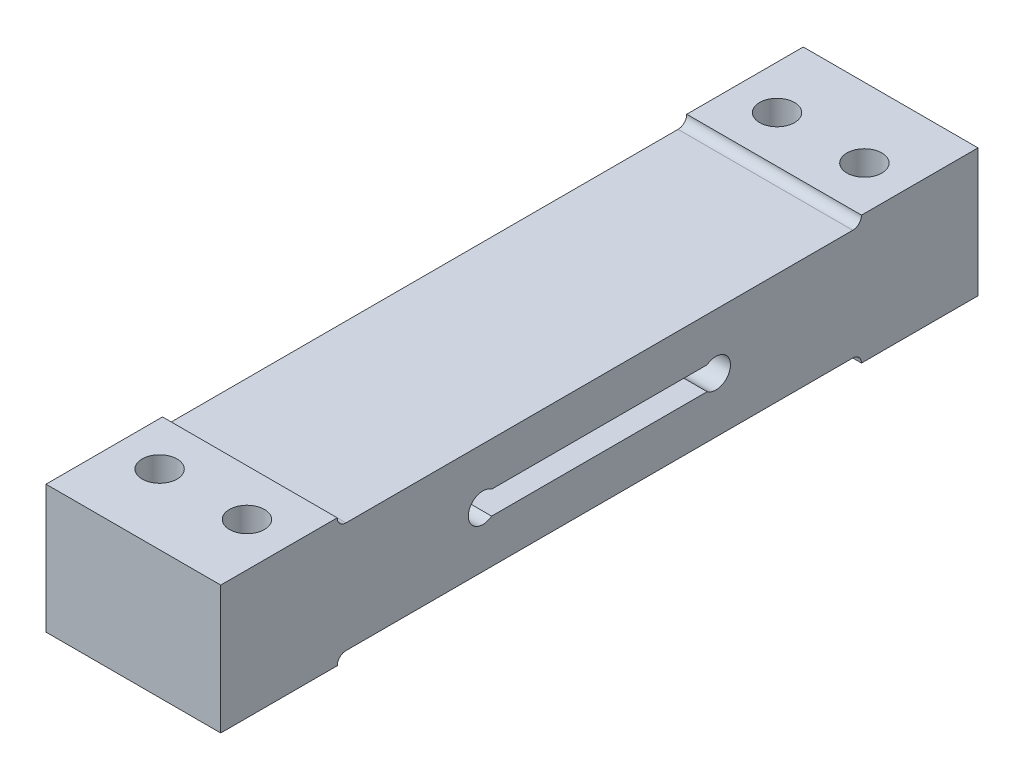
ISO-10303-21;
HEADER;
FILE_DESCRIPTION(('STEP AP214'),'2;1');
FILE_NAME('part.step','',(''),(''),'','','');
FILE_SCHEMA(('AUTOMOTIVE_DESIGN { 1 0 10303 214 1 1 1 1 }'));
ENDSEC;
DATA;
#1=APPLICATION_CONTEXT('core data for automotive mechanical design processes');
#2=APPLICATION_PROTOCOL_DEFINITION('international standard','automotive_design',2000,#1);
#3=PRODUCT_CONTEXT('',#1,'mechanical');
#4=PRODUCT('Part','Part','',(#3));
#5=PRODUCT_RELATED_PRODUCT_CATEGORY('part','',(#4));
#6=PRODUCT_DEFINITION_FORMATION('','',#4);
#7=PRODUCT_DEFINITION_CONTEXT('part definition',#1,'design');
#8=PRODUCT_DEFINITION('design','',#6,#7);
#9=PRODUCT_DEFINITION_SHAPE('','',#8);
#10=(LENGTH_UNIT() NAMED_UNIT(*) SI_UNIT(.MILLI.,.METRE.));
#11=(NAMED_UNIT(*) PLANE_ANGLE_UNIT() SI_UNIT($,.RADIAN.));
#12=(NAMED_UNIT(*) SI_UNIT($,.STERADIAN.) SOLID_ANGLE_UNIT());
#13=UNCERTAINTY_MEASURE_WITH_UNIT(LENGTH_MEASURE(1.E-05),#10,'distance_accuracy_value','');
#14=(GEOMETRIC_REPRESENTATION_CONTEXT(3) GLOBAL_UNCERTAINTY_ASSIGNED_CONTEXT((#13)) GLOBAL_UNIT_ASSIGNED_CONTEXT((#10,
#11,#12)) REPRESENTATION_CONTEXT('',''));
#15=CARTESIAN_POINT('',(0.,0.,0.));
#16=DIRECTION('',(0.,0.,1.));
#17=DIRECTION('',(1.,0.,0.));
#18=AXIS2_PLACEMENT_3D('',#15,#16,#17);
#19=CARTESIAN_POINT('',(15.,-11.,-65.));
#20=DIRECTION('',(0.,1.,0.));
#21=DIRECTION('',(0.,0.,1.));
#22=AXIS2_PLACEMENT_3D('',#19,#20,#21);
#23=PLANE('',#22);
#24=CARTESIAN_POINT('',(-7.5,-11.,-53.));
#25=DIRECTION('',(0.,1.,0.));
#26=DIRECTION('',(0.,0.,1.));
#27=AXIS2_PLACEMENT_3D('',#24,#25,#26);
#28=CIRCLE('',#27,3.);
#29=CARTESIAN_POINT('',(-7.5,-11.,-50.));
#30=VERTEX_POINT('',#29);
#31=EDGE_CURVE('E208',#30,#30,#28,.T.);
#32=ORIENTED_EDGE('',*,*,#31,.T.);
#33=EDGE_LOOP('',(#32));
#34=FACE_BOUND('',#33,.T.);
#35=CARTESIAN_POINT('',(7.5,-11.,-53.));
#36=DIRECTION('',(0.,1.,0.));
#37=DIRECTION('',(0.,0.,1.));
#38=AXIS2_PLACEMENT_3D('',#35,#36,#37);
#39=CIRCLE('',#38,3.);
#40=CARTESIAN_POINT('',(7.5,-11.,-50.));
#41=VERTEX_POINT('',#40);
#42=EDGE_CURVE('E196',#41,#41,#39,.T.);
#43=ORIENTED_EDGE('',*,*,#42,.T.);
#44=EDGE_LOOP('',(#43));
#45=FACE_BOUND('',#44,.T.);
#46=DIRECTION('',(0.,0.,-1.));
#47=VECTOR('',#46,1.);
#48=CARTESIAN_POINT('',(15.,-11.,-65.));
#49=LINE('',#48,#47);
#50=CARTESIAN_POINT('',(15.,-11.,-45.));
#51=VERTEX_POINT('',#50);
#52=CARTESIAN_POINT('',(15.,-11.,-65.));
#53=VERTEX_POINT('',#52);
#54=EDGE_CURVE('E247',#51,#53,#49,.T.);
#55=ORIENTED_EDGE('',*,*,#54,.F.);
#56=DIRECTION('',(1.,0.,0.));
#57=VECTOR('',#56,1.);
#58=CARTESIAN_POINT('',(-15.,-11.,-45.));
#59=LINE('',#58,#57);
#60=CARTESIAN_POINT('',(-15.,-11.,-45.));
#61=VERTEX_POINT('',#60);
#62=EDGE_CURVE('E185',#61,#51,#59,.T.);
#63=ORIENTED_EDGE('',*,*,#62,.F.);
#64=DIRECTION('',(0.,0.,-1.));
#65=VECTOR('',#64,1.);
#66=CARTESIAN_POINT('',(-15.,-11.,-65.));
#67=LINE('',#66,#65);
#68=CARTESIAN_POINT('',(-15.,-11.,-65.));
#69=VERTEX_POINT('',#68);
#70=EDGE_CURVE('E259',#61,#69,#67,.T.);
#71=ORIENTED_EDGE('',*,*,#70,.T.);
#72=DIRECTION('',(-1.,0.,0.));
#73=VECTOR('',#72,1.);
#74=CARTESIAN_POINT('',(15.,-11.,-65.));
#75=LINE('',#74,#73);
#76=EDGE_CURVE('E268',#53,#69,#75,.T.);
#77=ORIENTED_EDGE('',*,*,#76,.F.);
#78=EDGE_LOOP('',(#55,#63,#71,#77));
#79=FACE_BOUND('',#78,.T.);
#80=ADVANCED_FACE('F33',(#34,#45,#79),#23,.F.);
#81=CARTESIAN_POINT('',(15.,11.,-65.));
#82=DIRECTION('',(0.,-1.,0.));
#83=DIRECTION('',(0.,0.,-1.));
#84=AXIS2_PLACEMENT_3D('',#81,#82,#83);
#85=PLANE('',#84);
#86=CARTESIAN_POINT('',(7.5,11.,53.));
#87=DIRECTION('',(0.,1.,0.));
#88=DIRECTION('',(0.,0.,1.));
#89=AXIS2_PLACEMENT_3D('',#86,#87,#88);
#90=CIRCLE('',#89,3.);
#91=CARTESIAN_POINT('',(7.5,11.,56.));
#92=VERTEX_POINT('',#91);
#93=EDGE_CURVE('E172',#92,#92,#90,.T.);
#94=ORIENTED_EDGE('',*,*,#93,.F.);
#95=EDGE_LOOP('',(#94));
#96=FACE_BOUND('',#95,.T.);
#97=CARTESIAN_POINT('',(-7.5,11.,53.));
#98=DIRECTION('',(0.,1.,0.));
#99=DIRECTION('',(0.,0.,1.));
#100=AXIS2_PLACEMENT_3D('',#97,#98,#99);
#101=CIRCLE('',#100,3.);
#102=CARTESIAN_POINT('',(-7.5,11.,56.));
#103=VERTEX_POINT('',#102);
#104=EDGE_CURVE('E193',#103,#103,#101,.T.);
#105=ORIENTED_EDGE('',*,*,#104,.F.);
#106=EDGE_LOOP('',(#105));
#107=FACE_BOUND('',#106,.T.);
#108=DIRECTION('',(0.,0.,1.));
#109=VECTOR('',#108,1.);
#110=CARTESIAN_POINT('',(15.,11.,-65.));
#111=LINE('',#110,#109);
#112=CARTESIAN_POINT('',(15.,11.,45.));
#113=VERTEX_POINT('',#112);
#114=CARTESIAN_POINT('',(15.,11.,65.));
#115=VERTEX_POINT('',#114);
#116=EDGE_CURVE('E253',#113,#115,#111,.T.);
#117=ORIENTED_EDGE('',*,*,#116,.F.);
#118=DIRECTION('',(1.,0.,0.));
#119=VECTOR('',#118,1.);
#120=CARTESIAN_POINT('',(-15.,11.,45.));
#121=LINE('',#120,#119);
#122=CARTESIAN_POINT('',(-15.,11.,45.));
#123=VERTEX_POINT('',#122);
#124=EDGE_CURVE('E169',#123,#113,#121,.T.);
#125=ORIENTED_EDGE('',*,*,#124,.F.);
#126=DIRECTION('',(0.,0.,1.));
#127=VECTOR('',#126,1.);
#128=CARTESIAN_POINT('',(-15.,11.,-65.));
#129=LINE('',#128,#127);
#130=CARTESIAN_POINT('',(-15.,11.,65.));
#131=VERTEX_POINT('',#130);
#132=EDGE_CURVE('E166',#123,#131,#129,.T.);
#133=ORIENTED_EDGE('',*,*,#132,.T.);
#134=DIRECTION('',(-1.,0.,0.));
#135=VECTOR('',#134,1.);
#136=CARTESIAN_POINT('',(15.,11.,65.));
#137=LINE('',#136,#135);
#138=EDGE_CURVE('E256',#115,#131,#137,.T.);
#139=ORIENTED_EDGE('',*,*,#138,.F.);
#140=EDGE_LOOP('',(#117,#125,#133,#139));
#141=FACE_BOUND('',#140,.T.);
#142=ADVANCED_FACE('F300',(#96,#107,#141),#85,.F.);
#143=CARTESIAN_POINT('',(15.,0.,0.));
#144=DIRECTION('',(1.,0.,0.));
#145=DIRECTION('',(0.,0.,-1.));
#146=AXIS2_PLACEMENT_3D('',#143,#144,#145);
#147=PLANE('',#146);
#148=DIRECTION('',(0.,0.,-1.));
#149=VECTOR('',#148,1.);
#150=CARTESIAN_POINT('',(15.,9.50000000000001,45.));
#151=LINE('',#150,#149);
#152=CARTESIAN_POINT('',(15.,9.50000000000001,43.5));
#153=VERTEX_POINT('',#152);
#154=CARTESIAN_POINT('',(15.,9.50000000000001,-43.5));
#155=VERTEX_POINT('',#154);
#156=EDGE_CURVE('E174',#153,#155,#151,.T.);
#157=ORIENTED_EDGE('',*,*,#156,.F.);
#158=CARTESIAN_POINT('',(15.,11.,43.5));
#159=DIRECTION('',(1.,0.,0.));
#160=DIRECTION('',(0.,0.,-1.));
#161=AXIS2_PLACEMENT_3D('',#158,#159,#160);
#162=CIRCLE('',#161,1.5);
#163=EDGE_CURVE('E41',#153,#113,#162,.F.);
#164=ORIENTED_EDGE('',*,*,#163,.T.);
#165=ORIENTED_EDGE('',*,*,#116,.T.);
#166=DIRECTION('',(0.,-1.,0.));
#167=VECTOR('',#166,1.);
#168=CARTESIAN_POINT('',(15.,-11.,65.));
#169=LINE('',#168,#167);
#170=CARTESIAN_POINT('',(15.,-11.,65.));
#171=VERTEX_POINT('',#170);
#172=EDGE_CURVE('E165',#115,#171,#169,.T.);
#173=ORIENTED_EDGE('',*,*,#172,.T.);
#174=CARTESIAN_POINT('',(15.,-11.,45.));
#175=VERTEX_POINT('',#174);
#176=EDGE_CURVE('E248',#171,#175,#49,.T.);
#177=ORIENTED_EDGE('',*,*,#176,.T.);
#178=CARTESIAN_POINT('',(15.,-11.,43.5));
#179=DIRECTION('',(1.,0.,0.));
#180=DIRECTION('',(0.,0.,-1.));
#181=AXIS2_PLACEMENT_3D('',#178,#179,#180);
#182=CIRCLE('',#181,1.5);
#183=CARTESIAN_POINT('',(15.,-9.50000000000001,43.5));
#184=VERTEX_POINT('',#183);
#185=EDGE_CURVE('E283',#175,#184,#182,.F.);
#186=ORIENTED_EDGE('',*,*,#185,.T.);
#187=DIRECTION('',(0.,0.,1.));
#188=VECTOR('',#187,1.);
#189=CARTESIAN_POINT('',(15.,-9.50000000000001,45.));
#190=LINE('',#189,#188);
#191=CARTESIAN_POINT('',(15.,-9.50000000000001,-43.5));
#192=VERTEX_POINT('',#191);
#193=EDGE_CURVE('E182',#192,#184,#190,.T.);
#194=ORIENTED_EDGE('',*,*,#193,.F.);
#195=CARTESIAN_POINT('',(15.,-11.,-43.5));
#196=DIRECTION('',(1.,0.,0.));
#197=DIRECTION('',(0.,0.,-1.));
#198=AXIS2_PLACEMENT_3D('',#195,#196,#197);
#199=CIRCLE('',#198,1.5);
#200=EDGE_CURVE('E287',#192,#51,#199,.F.);
#201=ORIENTED_EDGE('',*,*,#200,.T.);
#202=ORIENTED_EDGE('',*,*,#54,.T.);
#203=DIRECTION('',(0.,1.,0.));
#204=VECTOR('',#203,1.);
#205=CARTESIAN_POINT('',(15.,-11.,-65.));
#206=LINE('',#205,#204);
#207=CARTESIAN_POINT('',(15.,11.,-65.));
#208=VERTEX_POINT('',#207);
#209=EDGE_CURVE('E251',#53,#208,#206,.T.);
#210=ORIENTED_EDGE('',*,*,#209,.T.);
#211=CARTESIAN_POINT('',(15.,11.,-45.));
#212=VERTEX_POINT('',#211);
#213=EDGE_CURVE('E254',#208,#212,#111,.T.);
#214=ORIENTED_EDGE('',*,*,#213,.T.);
#215=CARTESIAN_POINT('',(15.,11.,-43.5));
#216=DIRECTION('',(1.,0.,0.));
#217=DIRECTION('',(0.,0.,-1.));
#218=AXIS2_PLACEMENT_3D('',#215,#216,#217);
#219=CIRCLE('',#218,1.5);
#220=EDGE_CURVE('E154',#212,#155,#219,.F.);
#221=ORIENTED_EDGE('',*,*,#220,.T.);
#222=EDGE_LOOP('',(#157,#164,#165,#173,#177,#186,#194,#201,#202,#210,#214,#221));
#223=FACE_BOUND('',#222,.T.);
#224=DIRECTION('',(0.,0.,-1.));
#225=VECTOR('',#224,1.);
#226=CARTESIAN_POINT('',(15.,-2.,18.5));
#227=LINE('',#226,#225);
#228=CARTESIAN_POINT('',(15.,-2.,18.5));
#229=VERTEX_POINT('',#228);
#230=CARTESIAN_POINT('',(15.,-2.,-18.5));
#231=VERTEX_POINT('',#230);
#232=EDGE_CURVE('E216',#229,#231,#227,.T.);
#233=ORIENTED_EDGE('',*,*,#232,.F.);
#234=CARTESIAN_POINT('',(15.,0.,20.));
#235=DIRECTION('',(1.,0.,0.));
#236=DIRECTION('',(0.,0.,-1.));
#237=AXIS2_PLACEMENT_3D('',#234,#235,#236);
#238=CIRCLE('',#237,2.5);
#239=CARTESIAN_POINT('',(15.,2.,18.5));
#240=VERTEX_POINT('',#239);
#241=EDGE_CURVE('E214',#240,#229,#238,.T.);
#242=ORIENTED_EDGE('',*,*,#241,.F.);
#243=DIRECTION('',(0.,0.,1.));
#244=VECTOR('',#243,1.);
#245=CARTESIAN_POINT('',(15.,2.,18.5));
#246=LINE('',#245,#244);
#247=CARTESIAN_POINT('',(15.,2.,-18.5));
#248=VERTEX_POINT('',#247);
#249=EDGE_CURVE('E222',#248,#240,#246,.T.);
#250=ORIENTED_EDGE('',*,*,#249,.F.);
#251=CARTESIAN_POINT('',(15.,0.,-20.));
#252=DIRECTION('',(1.,0.,0.));
#253=DIRECTION('',(0.,0.,-1.));
#254=AXIS2_PLACEMENT_3D('',#251,#252,#253);
#255=CIRCLE('',#254,2.5);
#256=EDGE_CURVE('E219',#231,#248,#255,.T.);
#257=ORIENTED_EDGE('',*,*,#256,.F.);
#258=EDGE_LOOP('',(#233,#242,#250,#257));
#259=FACE_BOUND('',#258,.T.);
#260=ADVANCED_FACE('F294',(#223,#259),#147,.T.);
#261=CARTESIAN_POINT('',(-15.,0.,0.));
#262=DIRECTION('',(1.,0.,0.));
#263=DIRECTION('',(0.,0.,-1.));
#264=AXIS2_PLACEMENT_3D('',#261,#262,#263);
#265=PLANE('',#264);
#266=ORIENTED_EDGE('',*,*,#132,.F.);
#267=CARTESIAN_POINT('',(-15.,11.,43.5));
#268=DIRECTION('',(1.,0.,0.));
#269=DIRECTION('',(0.,0.,-1.));
#270=AXIS2_PLACEMENT_3D('',#267,#268,#269);
#271=CIRCLE('',#270,1.5);
#272=CARTESIAN_POINT('',(-15.,9.50000000000001,43.5));
#273=VERTEX_POINT('',#272);
#274=EDGE_CURVE('E11',#123,#273,#271,.T.);
#275=ORIENTED_EDGE('',*,*,#274,.T.);
#276=DIRECTION('',(0.,0.,-1.));
#277=VECTOR('',#276,1.);
#278=CARTESIAN_POINT('',(-15.,9.50000000000001,45.));
#279=LINE('',#278,#277);
#280=CARTESIAN_POINT('',(-15.,9.50000000000001,-43.5));
#281=VERTEX_POINT('',#280);
#282=EDGE_CURVE('E151',#273,#281,#279,.T.);
#283=ORIENTED_EDGE('',*,*,#282,.T.);
#284=CARTESIAN_POINT('',(-15.,11.,-43.5));
#285=DIRECTION('',(1.,0.,0.));
#286=DIRECTION('',(0.,0.,-1.));
#287=AXIS2_PLACEMENT_3D('',#284,#285,#286);
#288=CIRCLE('',#287,1.5);
#289=CARTESIAN_POINT('',(-15.,11.,-45.));
#290=VERTEX_POINT('',#289);
#291=EDGE_CURVE('E145',#281,#290,#288,.T.);
#292=ORIENTED_EDGE('',*,*,#291,.T.);
#293=CARTESIAN_POINT('',(-15.,11.,-65.));
#294=VERTEX_POINT('',#293);
#295=EDGE_CURVE('E150',#294,#290,#129,.T.);
#296=ORIENTED_EDGE('',*,*,#295,.F.);
#297=DIRECTION('',(0.,1.,0.));
#298=VECTOR('',#297,1.);
#299=CARTESIAN_POINT('',(-15.,-11.,-65.));
#300=LINE('',#299,#298);
#301=EDGE_CURVE('E263',#69,#294,#300,.T.);
#302=ORIENTED_EDGE('',*,*,#301,.F.);
#303=ORIENTED_EDGE('',*,*,#70,.F.);
#304=CARTESIAN_POINT('',(-15.,-11.,-43.5));
#305=DIRECTION('',(1.,0.,0.));
#306=DIRECTION('',(0.,0.,-1.));
#307=AXIS2_PLACEMENT_3D('',#304,#305,#306);
#308=CIRCLE('',#307,1.5);
#309=CARTESIAN_POINT('',(-15.,-9.50000000000001,-43.5));
#310=VERTEX_POINT('',#309);
#311=EDGE_CURVE('E289',#61,#310,#308,.T.);
#312=ORIENTED_EDGE('',*,*,#311,.T.);
#313=DIRECTION('',(0.,0.,1.));
#314=VECTOR('',#313,1.);
#315=CARTESIAN_POINT('',(-15.,-9.50000000000001,45.));
#316=LINE('',#315,#314);
#317=CARTESIAN_POINT('',(-15.,-9.50000000000001,43.5));
#318=VERTEX_POINT('',#317);
#319=EDGE_CURVE('E178',#310,#318,#316,.T.);
#320=ORIENTED_EDGE('',*,*,#319,.T.);
#321=CARTESIAN_POINT('',(-15.,-11.,43.5));
#322=DIRECTION('',(1.,0.,0.));
#323=DIRECTION('',(0.,0.,-1.));
#324=AXIS2_PLACEMENT_3D('',#321,#322,#323);
#325=CIRCLE('',#324,1.5);
#326=CARTESIAN_POINT('',(-15.,-11.,45.));
#327=VERTEX_POINT('',#326);
#328=EDGE_CURVE('E285',#318,#327,#325,.T.);
#329=ORIENTED_EDGE('',*,*,#328,.T.);
#330=CARTESIAN_POINT('',(-15.,-11.,65.));
#331=VERTEX_POINT('',#330);
#332=EDGE_CURVE('E260',#331,#327,#67,.T.);
#333=ORIENTED_EDGE('',*,*,#332,.F.);
#334=DIRECTION('',(0.,-1.,0.));
#335=VECTOR('',#334,1.);
#336=CARTESIAN_POINT('',(-15.,-11.,65.));
#337=LINE('',#336,#335);
#338=EDGE_CURVE('E244',#131,#331,#337,.T.);
#339=ORIENTED_EDGE('',*,*,#338,.F.);
#340=EDGE_LOOP('',(#266,#275,#283,#292,#296,#302,#303,#312,#320,#329,#333,#339));
#341=FACE_BOUND('',#340,.T.);
#342=CARTESIAN_POINT('',(-15.,0.,20.));
#343=DIRECTION('',(1.,0.,0.));
#344=DIRECTION('',(0.,0.,-1.));
#345=AXIS2_PLACEMENT_3D('',#342,#343,#344);
#346=CIRCLE('',#345,2.5);
#347=CARTESIAN_POINT('',(-15.,2.,18.5));
#348=VERTEX_POINT('',#347);
#349=CARTESIAN_POINT('',(-15.,-2.,18.5));
#350=VERTEX_POINT('',#349);
#351=EDGE_CURVE('E211',#348,#350,#346,.T.);
#352=ORIENTED_EDGE('',*,*,#351,.T.);
#353=DIRECTION('',(0.,0.,-1.));
#354=VECTOR('',#353,1.);
#355=CARTESIAN_POINT('',(-15.,-2.,18.5));
#356=LINE('',#355,#354);
#357=CARTESIAN_POINT('',(-15.,-2.,-18.5));
#358=VERTEX_POINT('',#357);
#359=EDGE_CURVE('E227',#350,#358,#356,.T.);
#360=ORIENTED_EDGE('',*,*,#359,.T.);
#361=CARTESIAN_POINT('',(-15.,0.,-20.));
#362=DIRECTION('',(1.,0.,0.));
#363=DIRECTION('',(0.,0.,-1.));
#364=AXIS2_PLACEMENT_3D('',#361,#362,#363);
#365=CIRCLE('',#364,2.5);
#366=CARTESIAN_POINT('',(-15.,2.,-18.5));
#367=VERTEX_POINT('',#366);
#368=EDGE_CURVE('E230',#358,#367,#365,.T.);
#369=ORIENTED_EDGE('',*,*,#368,.T.);
#370=DIRECTION('',(0.,0.,1.));
#371=VECTOR('',#370,1.);
#372=CARTESIAN_POINT('',(-15.,2.,18.5));
#373=LINE('',#372,#371);
#374=EDGE_CURVE('E217',#367,#348,#373,.T.);
#375=ORIENTED_EDGE('',*,*,#374,.T.);
#376=EDGE_LOOP('',(#352,#360,#369,#375));
#377=FACE_BOUND('',#376,.T.);
#378=ADVANCED_FACE('F147',(#341,#377),#265,.F.);
#379=CARTESIAN_POINT('',(15.,-11.,65.));
#380=DIRECTION('',(0.,0.,-1.));
#381=DIRECTION('',(-1.,0.,0.));
#382=AXIS2_PLACEMENT_3D('',#379,#380,#381);
#383=PLANE('',#382);
#384=ORIENTED_EDGE('',*,*,#338,.T.);
#385=DIRECTION('',(-1.,0.,0.));
#386=VECTOR('',#385,1.);
#387=CARTESIAN_POINT('',(15.,-11.,65.));
#388=LINE('',#387,#386);
#389=EDGE_CURVE('E271',#171,#331,#388,.T.);
#390=ORIENTED_EDGE('',*,*,#389,.F.);
#391=ORIENTED_EDGE('',*,*,#172,.F.);
#392=ORIENTED_EDGE('',*,*,#138,.T.);
#393=EDGE_LOOP('',(#384,#390,#391,#392));
#394=FACE_BOUND('',#393,.T.);
#395=ADVANCED_FACE('F332',(#394),#383,.F.);
#396=CARTESIAN_POINT('',(-7.5,-11.,53.));
#397=DIRECTION('',(0.,1.,0.));
#398=DIRECTION('',(0.,0.,1.));
#399=AXIS2_PLACEMENT_3D('',#396,#397,#398);
#400=CIRCLE('',#399,3.);
#401=CARTESIAN_POINT('',(-7.5,-11.,56.));
#402=VERTEX_POINT('',#401);
#403=EDGE_CURVE('E203',#402,#402,#400,.T.);
#404=ORIENTED_EDGE('',*,*,#403,.T.);
#405=EDGE_LOOP('',(#404));
#406=FACE_BOUND('',#405,.T.);
#407=CARTESIAN_POINT('',(7.5,-11.,53.));
#408=DIRECTION('',(0.,1.,0.));
#409=DIRECTION('',(0.,0.,1.));
#410=AXIS2_PLACEMENT_3D('',#407,#408,#409);
#411=CIRCLE('',#410,3.);
#412=CARTESIAN_POINT('',(7.5,-11.,56.));
#413=VERTEX_POINT('',#412);
#414=EDGE_CURVE('E190',#413,#413,#411,.T.);
#415=ORIENTED_EDGE('',*,*,#414,.T.);
#416=EDGE_LOOP('',(#415));
#417=FACE_BOUND('',#416,.T.);
#418=ORIENTED_EDGE('',*,*,#332,.T.);
#419=DIRECTION('',(1.,0.,0.));
#420=VECTOR('',#419,1.);
#421=CARTESIAN_POINT('',(-15.,-11.,45.));
#422=LINE('',#421,#420);
#423=EDGE_CURVE('E181',#327,#175,#422,.T.);
#424=ORIENTED_EDGE('',*,*,#423,.T.);
#425=ORIENTED_EDGE('',*,*,#176,.F.);
#426=ORIENTED_EDGE('',*,*,#389,.T.);
#427=EDGE_LOOP('',(#418,#424,#425,#426));
#428=FACE_BOUND('',#427,.T.);
#429=ADVANCED_FACE('F320',(#406,#417,#428),#23,.F.);
#430=CARTESIAN_POINT('',(15.,-11.,-65.));
#431=DIRECTION('',(0.,0.,1.));
#432=DIRECTION('',(1.,0.,0.));
#433=AXIS2_PLACEMENT_3D('',#430,#431,#432);
#434=PLANE('',#433);
#435=ORIENTED_EDGE('',*,*,#301,.T.);
#436=DIRECTION('',(-1.,0.,0.));
#437=VECTOR('',#436,1.);
#438=CARTESIAN_POINT('',(15.,11.,-65.));
#439=LINE('',#438,#437);
#440=EDGE_CURVE('E164',#208,#294,#439,.T.);
#441=ORIENTED_EDGE('',*,*,#440,.F.);
#442=ORIENTED_EDGE('',*,*,#209,.F.);
#443=ORIENTED_EDGE('',*,*,#76,.T.);
#444=EDGE_LOOP('',(#435,#441,#442,#443));
#445=FACE_BOUND('',#444,.T.);
#446=ADVANCED_FACE('F331',(#445),#434,.F.);
#447=CARTESIAN_POINT('',(7.5,11.,-53.));
#448=DIRECTION('',(0.,1.,0.));
#449=DIRECTION('',(0.,0.,1.));
#450=AXIS2_PLACEMENT_3D('',#447,#448,#449);
#451=CIRCLE('',#450,3.);
#452=CARTESIAN_POINT('',(7.5,11.,-50.));
#453=VERTEX_POINT('',#452);
#454=EDGE_CURVE('E200',#453,#453,#451,.T.);
#455=ORIENTED_EDGE('',*,*,#454,.F.);
#456=EDGE_LOOP('',(#455));
#457=FACE_BOUND('',#456,.T.);
#458=CARTESIAN_POINT('',(-7.5,11.,-53.));
#459=DIRECTION('',(0.,1.,0.));
#460=DIRECTION('',(0.,0.,1.));
#461=AXIS2_PLACEMENT_3D('',#458,#459,#460);
#462=CIRCLE('',#461,3.);
#463=CARTESIAN_POINT('',(-7.5,11.,-50.));
#464=VERTEX_POINT('',#463);
#465=EDGE_CURVE('E199',#464,#464,#462,.T.);
#466=ORIENTED_EDGE('',*,*,#465,.F.);
#467=EDGE_LOOP('',(#466));
#468=FACE_BOUND('',#467,.T.);
#469=ORIENTED_EDGE('',*,*,#295,.T.);
#470=DIRECTION('',(1.,0.,0.));
#471=VECTOR('',#470,1.);
#472=CARTESIAN_POINT('',(-15.,11.,-45.));
#473=LINE('',#472,#471);
#474=EDGE_CURVE('E161',#290,#212,#473,.T.);
#475=ORIENTED_EDGE('',*,*,#474,.T.);
#476=ORIENTED_EDGE('',*,*,#213,.F.);
#477=ORIENTED_EDGE('',*,*,#440,.T.);
#478=EDGE_LOOP('',(#469,#475,#476,#477));
#479=FACE_BOUND('',#478,.T.);
#480=ADVANCED_FACE('F159',(#457,#468,#479),#85,.F.);
#481=CARTESIAN_POINT('',(15.,0.,20.));
#482=DIRECTION('',(-1.,0.,0.));
#483=DIRECTION('',(0.,0.,1.));
#484=AXIS2_PLACEMENT_3D('',#481,#482,#483);
#485=CYLINDRICAL_SURFACE('',#484,2.5);
#486=ORIENTED_EDGE('',*,*,#351,.F.);
#487=DIRECTION('',(-1.,0.,0.));
#488=VECTOR('',#487,1.);
#489=CARTESIAN_POINT('',(15.,2.,18.5));
#490=LINE('',#489,#488);
#491=EDGE_CURVE('E224',#240,#348,#490,.T.);
#492=ORIENTED_EDGE('',*,*,#491,.F.);
#493=ORIENTED_EDGE('',*,*,#241,.T.);
#494=DIRECTION('',(-1.,0.,0.));
#495=VECTOR('',#494,1.);
#496=CARTESIAN_POINT('',(15.,-2.,18.5));
#497=LINE('',#496,#495);
#498=EDGE_CURVE('E241',#229,#350,#497,.T.);
#499=ORIENTED_EDGE('',*,*,#498,.T.);
#500=EDGE_LOOP('',(#486,#492,#493,#499));
#501=FACE_BOUND('',#500,.T.);
#502=ADVANCED_FACE('F386',(#501),#485,.F.);
#503=CARTESIAN_POINT('',(15.,-2.,18.5));
#504=DIRECTION('',(0.,1.,0.));
#505=DIRECTION('',(0.,0.,1.));
#506=AXIS2_PLACEMENT_3D('',#503,#504,#505);
#507=PLANE('',#506);
#508=ORIENTED_EDGE('',*,*,#359,.F.);
#509=ORIENTED_EDGE('',*,*,#498,.F.);
#510=ORIENTED_EDGE('',*,*,#232,.T.);
#511=DIRECTION('',(-1.,0.,0.));
#512=VECTOR('',#511,1.);
#513=CARTESIAN_POINT('',(15.,-2.,-18.5));
#514=LINE('',#513,#512);
#515=EDGE_CURVE('E239',#231,#358,#514,.T.);
#516=ORIENTED_EDGE('',*,*,#515,.T.);
#517=EDGE_LOOP('',(#508,#509,#510,#516));
#518=FACE_BOUND('',#517,.T.);
#519=ADVANCED_FACE('F400',(#518),#507,.T.);
#520=CARTESIAN_POINT('',(15.,0.,-20.));
#521=DIRECTION('',(-1.,0.,0.));
#522=DIRECTION('',(0.,0.,1.));
#523=AXIS2_PLACEMENT_3D('',#520,#521,#522);
#524=CYLINDRICAL_SURFACE('',#523,2.5);
#525=ORIENTED_EDGE('',*,*,#368,.F.);
#526=ORIENTED_EDGE('',*,*,#515,.F.);
#527=ORIENTED_EDGE('',*,*,#256,.T.);
#528=DIRECTION('',(-1.,0.,0.));
#529=VECTOR('',#528,1.);
#530=CARTESIAN_POINT('',(15.,2.,-18.5));
#531=LINE('',#530,#529);
#532=EDGE_CURVE('E237',#248,#367,#531,.T.);
#533=ORIENTED_EDGE('',*,*,#532,.T.);
#534=EDGE_LOOP('',(#525,#526,#527,#533));
#535=FACE_BOUND('',#534,.T.);
#536=ADVANCED_FACE('F407',(#535),#524,.F.);
#537=CARTESIAN_POINT('',(15.,2.,18.5));
#538=DIRECTION('',(0.,-1.,0.));
#539=DIRECTION('',(0.,0.,-1.));
#540=AXIS2_PLACEMENT_3D('',#537,#538,#539);
#541=PLANE('',#540);
#542=ORIENTED_EDGE('',*,*,#374,.F.);
#543=ORIENTED_EDGE('',*,*,#532,.F.);
#544=ORIENTED_EDGE('',*,*,#249,.T.);
#545=ORIENTED_EDGE('',*,*,#491,.T.);
#546=EDGE_LOOP('',(#542,#543,#544,#545));
#547=FACE_BOUND('',#546,.T.);
#548=ADVANCED_FACE('F415',(#547),#541,.T.);
#549=CARTESIAN_POINT('',(-7.5,-11.,-53.));
#550=DIRECTION('',(0.,1.,0.));
#551=DIRECTION('',(0.,0.,1.));
#552=AXIS2_PLACEMENT_3D('',#549,#550,#551);
#553=CYLINDRICAL_SURFACE('',#552,3.);
#554=ORIENTED_EDGE('',*,*,#31,.F.);
#555=EDGE_LOOP('',(#554));
#556=FACE_BOUND('',#555,.T.);
#557=ORIENTED_EDGE('',*,*,#465,.T.);
#558=EDGE_LOOP('',(#557));
#559=FACE_BOUND('',#558,.T.);
#560=ADVANCED_FACE('F423',(#556,#559),#553,.F.);
#561=CARTESIAN_POINT('',(7.5,-11.,53.));
#562=DIRECTION('',(0.,1.,0.));
#563=DIRECTION('',(0.,0.,1.));
#564=AXIS2_PLACEMENT_3D('',#561,#562,#563);
#565=CYLINDRICAL_SURFACE('',#564,3.);
#566=ORIENTED_EDGE('',*,*,#414,.F.);
#567=EDGE_LOOP('',(#566));
#568=FACE_BOUND('',#567,.T.);
#569=ORIENTED_EDGE('',*,*,#93,.T.);
#570=EDGE_LOOP('',(#569));
#571=FACE_BOUND('',#570,.T.);
#572=ADVANCED_FACE('F441',(#568,#571),#565,.F.);
#573=CARTESIAN_POINT('',(-7.5,-11.,53.));
#574=DIRECTION('',(0.,1.,0.));
#575=DIRECTION('',(0.,0.,1.));
#576=AXIS2_PLACEMENT_3D('',#573,#574,#575);
#577=CYLINDRICAL_SURFACE('',#576,3.);
#578=ORIENTED_EDGE('',*,*,#403,.F.);
#579=EDGE_LOOP('',(#578));
#580=FACE_BOUND('',#579,.T.);
#581=ORIENTED_EDGE('',*,*,#104,.T.);
#582=EDGE_LOOP('',(#581));
#583=FACE_BOUND('',#582,.T.);
#584=ADVANCED_FACE('F314',(#580,#583),#577,.F.);
#585=CARTESIAN_POINT('',(7.5,-11.,-53.));
#586=DIRECTION('',(0.,1.,0.));
#587=DIRECTION('',(0.,0.,1.));
#588=AXIS2_PLACEMENT_3D('',#585,#586,#587);
#589=CYLINDRICAL_SURFACE('',#588,3.);
#590=ORIENTED_EDGE('',*,*,#42,.F.);
#591=EDGE_LOOP('',(#590));
#592=FACE_BOUND('',#591,.T.);
#593=ORIENTED_EDGE('',*,*,#454,.T.);
#594=EDGE_LOOP('',(#593));
#595=FACE_BOUND('',#594,.T.);
#596=ADVANCED_FACE('F305',(#592,#595),#589,.F.);
#597=CARTESIAN_POINT('',(-15.,9.50000000000001,45.));
#598=DIRECTION('',(0.,-1.,0.));
#599=DIRECTION('',(0.,0.,-1.));
#600=AXIS2_PLACEMENT_3D('',#597,#598,#599);
#601=PLANE('',#600);
#602=ORIENTED_EDGE('',*,*,#156,.T.);
#603=DIRECTION('',(1.,0.,0.));
#604=VECTOR('',#603,1.);
#605=CARTESIAN_POINT('',(-15.,9.50000000000001,-43.5));
#606=LINE('',#605,#604);
#607=EDGE_CURVE('E48',#155,#281,#606,.F.);
#608=ORIENTED_EDGE('',*,*,#607,.T.);
#609=ORIENTED_EDGE('',*,*,#282,.F.);
#610=DIRECTION('',(1.,0.,0.));
#611=VECTOR('',#610,1.);
#612=CARTESIAN_POINT('',(15.,9.50000000000001,43.5));
#613=LINE('',#612,#611);
#614=EDGE_CURVE('E279',#273,#153,#613,.T.);
#615=ORIENTED_EDGE('',*,*,#614,.T.);
#616=EDGE_LOOP('',(#602,#608,#609,#615));
#617=FACE_BOUND('',#616,.T.);
#618=ADVANCED_FACE('F302',(#617),#601,.F.);
#619=CARTESIAN_POINT('',(-15.,-9.50000000000001,45.));
#620=DIRECTION('',(0.,1.,0.));
#621=DIRECTION('',(0.,0.,1.));
#622=AXIS2_PLACEMENT_3D('',#619,#620,#621);
#623=PLANE('',#622);
#624=ORIENTED_EDGE('',*,*,#193,.T.);
#625=DIRECTION('',(1.,0.,0.));
#626=VECTOR('',#625,1.);
#627=CARTESIAN_POINT('',(-15.,-9.50000000000001,43.5));
#628=LINE('',#627,#626);
#629=EDGE_CURVE('E277',#184,#318,#628,.F.);
#630=ORIENTED_EDGE('',*,*,#629,.T.);
#631=ORIENTED_EDGE('',*,*,#319,.F.);
#632=DIRECTION('',(1.,0.,0.));
#633=VECTOR('',#632,1.);
#634=CARTESIAN_POINT('',(15.,-9.50000000000001,-43.5));
#635=LINE('',#634,#633);
#636=EDGE_CURVE('E274',#310,#192,#635,.T.);
#637=ORIENTED_EDGE('',*,*,#636,.T.);
#638=EDGE_LOOP('',(#624,#630,#631,#637));
#639=FACE_BOUND('',#638,.T.);
#640=ADVANCED_FACE('F304',(#639),#623,.F.);
#641=CARTESIAN_POINT('',(-15.,-11.,43.5));
#642=DIRECTION('',(-1.,0.,0.));
#643=DIRECTION('',(0.,0.,1.));
#644=AXIS2_PLACEMENT_3D('',#641,#642,#643);
#645=CYLINDRICAL_SURFACE('',#644,1.5);
#646=ORIENTED_EDGE('',*,*,#328,.F.);
#647=ORIENTED_EDGE('',*,*,#629,.F.);
#648=ORIENTED_EDGE('',*,*,#185,.F.);
#649=ORIENTED_EDGE('',*,*,#423,.F.);
#650=EDGE_LOOP('',(#646,#647,#648,#649));
#651=FACE_BOUND('',#650,.T.);
#652=ADVANCED_FACE('F311',(#651),#645,.F.);
#653=CARTESIAN_POINT('',(-15.,-11.,-43.5));
#654=DIRECTION('',(-1.,0.,0.));
#655=DIRECTION('',(0.,0.,1.));
#656=AXIS2_PLACEMENT_3D('',#653,#654,#655);
#657=CYLINDRICAL_SURFACE('',#656,1.5);
#658=ORIENTED_EDGE('',*,*,#311,.F.);
#659=ORIENTED_EDGE('',*,*,#62,.T.);
#660=ORIENTED_EDGE('',*,*,#200,.F.);
#661=ORIENTED_EDGE('',*,*,#636,.F.);
#662=EDGE_LOOP('',(#658,#659,#660,#661));
#663=FACE_BOUND('',#662,.T.);
#664=ADVANCED_FACE('F357',(#663),#657,.F.);
#665=CARTESIAN_POINT('',(-15.,11.,-43.5));
#666=DIRECTION('',(-1.,0.,0.));
#667=DIRECTION('',(0.,0.,1.));
#668=AXIS2_PLACEMENT_3D('',#665,#666,#667);
#669=CYLINDRICAL_SURFACE('',#668,1.5);
#670=ORIENTED_EDGE('',*,*,#291,.F.);
#671=ORIENTED_EDGE('',*,*,#607,.F.);
#672=ORIENTED_EDGE('',*,*,#220,.F.);
#673=ORIENTED_EDGE('',*,*,#474,.F.);
#674=EDGE_LOOP('',(#670,#671,#672,#673));
#675=FACE_BOUND('',#674,.T.);
#676=ADVANCED_FACE('F168',(#675),#669,.F.);
#677=CARTESIAN_POINT('',(-15.,11.,43.5));
#678=DIRECTION('',(-1.,0.,0.));
#679=DIRECTION('',(0.,0.,1.));
#680=AXIS2_PLACEMENT_3D('',#677,#678,#679);
#681=CYLINDRICAL_SURFACE('',#680,1.5);
#682=ORIENTED_EDGE('',*,*,#274,.F.);
#683=ORIENTED_EDGE('',*,*,#124,.T.);
#684=ORIENTED_EDGE('',*,*,#163,.F.);
#685=ORIENTED_EDGE('',*,*,#614,.F.);
#686=EDGE_LOOP('',(#682,#683,#684,#685));
#687=FACE_BOUND('',#686,.T.);
#688=ADVANCED_FACE('F35',(#687),#681,.F.);
#689=CLOSED_SHELL('',(#80,#142,#260,#378,#395,#429,#446,#480,#502,#519,#536,#548,#560,#572,#584,
#596,#618,#640,#652,#664,#676,#688));
#690=MANIFOLD_SOLID_BREP('B2',#689);
#691=ADVANCED_BREP_SHAPE_REPRESENTATION('',(#18,#690),#14);
#692=SHAPE_DEFINITION_REPRESENTATION(#9,#691);
ENDSEC;
END-ISO-10303-21;
